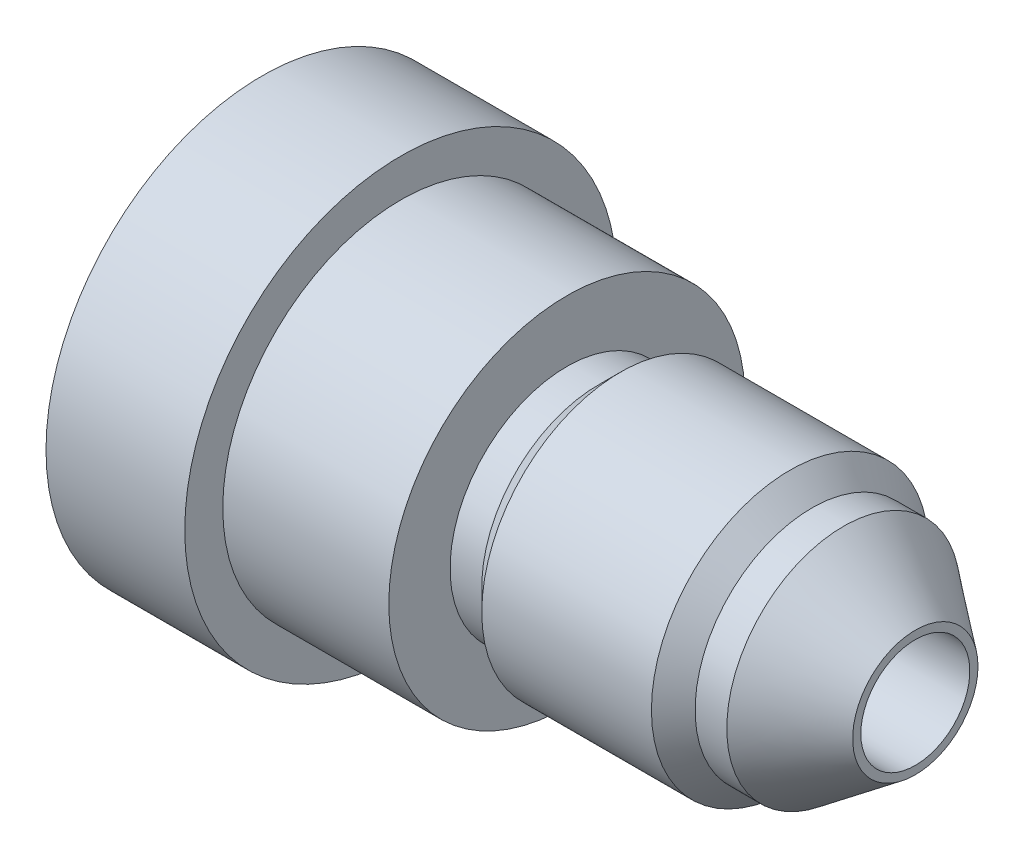
ISO-10303-21;
HEADER;
FILE_DESCRIPTION(('STEP AP214'),'2;1');
FILE_NAME('part.step','',(''),(''),'','','');
FILE_SCHEMA(('AUTOMOTIVE_DESIGN { 1 0 10303 214 1 1 1 1 }'));
ENDSEC;
DATA;
#1=APPLICATION_CONTEXT('core data for automotive mechanical design processes');
#2=APPLICATION_PROTOCOL_DEFINITION('international standard','automotive_design',2000,#1);
#3=PRODUCT_CONTEXT('',#1,'mechanical');
#4=PRODUCT('Part','Part','',(#3));
#5=PRODUCT_RELATED_PRODUCT_CATEGORY('part','',(#4));
#6=PRODUCT_DEFINITION_FORMATION('','',#4);
#7=PRODUCT_DEFINITION_CONTEXT('part definition',#1,'design');
#8=PRODUCT_DEFINITION('design','',#6,#7);
#9=PRODUCT_DEFINITION_SHAPE('','',#8);
#10=(LENGTH_UNIT() NAMED_UNIT(*) SI_UNIT(.MILLI.,.METRE.));
#11=(NAMED_UNIT(*) PLANE_ANGLE_UNIT() SI_UNIT($,.RADIAN.));
#12=(NAMED_UNIT(*) SI_UNIT($,.STERADIAN.) SOLID_ANGLE_UNIT());
#13=UNCERTAINTY_MEASURE_WITH_UNIT(LENGTH_MEASURE(1.E-05),#10,'distance_accuracy_value','');
#14=(GEOMETRIC_REPRESENTATION_CONTEXT(3) GLOBAL_UNCERTAINTY_ASSIGNED_CONTEXT((#13)) GLOBAL_UNIT_ASSIGNED_CONTEXT((#10,
#11,#12)) REPRESENTATION_CONTEXT('',''));
#15=CARTESIAN_POINT('',(0.,0.,0.));
#16=DIRECTION('',(0.,0.,1.));
#17=DIRECTION('',(1.,0.,0.));
#18=AXIS2_PLACEMENT_3D('',#15,#16,#17);
#19=CARTESIAN_POINT('',(-13.0937,0.,0.));
#20=DIRECTION('',(-1.,0.,0.));
#21=DIRECTION('',(0.,0.,1.));
#22=AXIS2_PLACEMENT_3D('',#19,#20,#21);
#23=CYLINDRICAL_SURFACE('',#22,5.55625);
#24=CARTESIAN_POINT('',(1.26938919710472,0.,0.));
#25=DIRECTION('',(1.,0.,0.));
#26=DIRECTION('',(0.,0.,-1.));
#27=AXIS2_PLACEMENT_3D('',#24,#25,#26);
#28=CIRCLE('',#27,5.55625);
#29=CARTESIAN_POINT('',(1.26938919710472,0.,-5.55625));
#30=VERTEX_POINT('',#29);
#31=EDGE_CURVE('E77',#30,#30,#28,.T.);
#32=ORIENTED_EDGE('',*,*,#31,.T.);
#33=EDGE_LOOP('',(#32));
#34=FACE_BOUND('',#33,.T.);
#35=CARTESIAN_POINT('',(8.07031304173335,0.,0.));
#36=DIRECTION('',(1.,0.,0.));
#37=DIRECTION('',(0.,0.,-1.));
#38=AXIS2_PLACEMENT_3D('',#35,#36,#37);
#39=CIRCLE('',#38,5.55625);
#40=CARTESIAN_POINT('',(8.07031304173335,0.,-5.55625));
#41=VERTEX_POINT('',#40);
#42=EDGE_CURVE('E74',#41,#41,#39,.T.);
#43=ORIENTED_EDGE('',*,*,#42,.F.);
#44=EDGE_LOOP('',(#43));
#45=FACE_BOUND('',#44,.T.);
#46=ADVANCED_FACE('F36',(#34,#45),#23,.T.);
#47=CARTESIAN_POINT('',(13.0937,2.1844,0.));
#48=DIRECTION('',(-1.,0.,0.));
#49=DIRECTION('',(0.,0.,1.));
#50=AXIS2_PLACEMENT_3D('',#47,#48,#49);
#51=PLANE('',#50);
#52=CARTESIAN_POINT('',(13.0937,0.,0.));
#53=DIRECTION('',(1.,0.,0.));
#54=DIRECTION('',(0.,0.,-1.));
#55=AXIS2_PLACEMENT_3D('',#52,#53,#54);
#56=CIRCLE('',#55,2.51206);
#57=CARTESIAN_POINT('',(13.0937,0.,-2.51206));
#58=VERTEX_POINT('',#57);
#59=EDGE_CURVE('E65',#58,#58,#56,.T.);
#60=ORIENTED_EDGE('',*,*,#59,.T.);
#61=EDGE_LOOP('',(#60));
#62=FACE_BOUND('',#61,.T.);
#63=CARTESIAN_POINT('',(13.0937,0.,0.));
#64=DIRECTION('',(-1.,0.,0.));
#65=DIRECTION('',(0.,0.,1.));
#66=AXIS2_PLACEMENT_3D('',#63,#64,#65);
#67=CIRCLE('',#66,2.1844);
#68=CARTESIAN_POINT('',(13.0937,0.,2.1844));
#69=VERTEX_POINT('',#68);
#70=EDGE_CURVE('E51',#69,#69,#67,.T.);
#71=ORIENTED_EDGE('',*,*,#70,.T.);
#72=EDGE_LOOP('',(#71));
#73=FACE_BOUND('',#72,.T.);
#74=ADVANCED_FACE('F108',(#62,#73),#51,.F.);
#75=CARTESIAN_POINT('',(-13.0937,0.,0.));
#76=DIRECTION('',(-1.,0.,0.));
#77=DIRECTION('',(0.,0.,1.));
#78=AXIS2_PLACEMENT_3D('',#75,#76,#77);
#79=CYLINDRICAL_SURFACE('',#78,8.6614);
#80=CARTESIAN_POINT('',(-13.0937,0.,0.));
#81=DIRECTION('',(-1.,0.,0.));
#82=DIRECTION('',(0.,0.,1.));
#83=AXIS2_PLACEMENT_3D('',#80,#81,#82);
#84=CIRCLE('',#83,8.6614);
#85=CARTESIAN_POINT('',(-13.0937,0.,8.6614));
#86=VERTEX_POINT('',#85);
#87=EDGE_CURVE('E62',#86,#86,#84,.T.);
#88=ORIENTED_EDGE('',*,*,#87,.F.);
#89=EDGE_LOOP('',(#88));
#90=FACE_BOUND('',#89,.T.);
#91=CARTESIAN_POINT('',(-7.5311,0.,0.));
#92=DIRECTION('',(-1.,0.,0.));
#93=DIRECTION('',(0.,0.,1.));
#94=AXIS2_PLACEMENT_3D('',#91,#92,#93);
#95=CIRCLE('',#94,8.6614);
#96=CARTESIAN_POINT('',(-7.5311,0.,8.6614));
#97=VERTEX_POINT('',#96);
#98=EDGE_CURVE('E10',#97,#97,#95,.T.);
#99=ORIENTED_EDGE('',*,*,#98,.T.);
#100=EDGE_LOOP('',(#99));
#101=FACE_BOUND('',#100,.T.);
#102=ADVANCED_FACE('F38',(#90,#101),#79,.T.);
#103=CARTESIAN_POINT('',(-7.5311,8.6614,0.));
#104=DIRECTION('',(-1.,0.,0.));
#105=DIRECTION('',(0.,0.,1.));
#106=AXIS2_PLACEMENT_3D('',#103,#104,#105);
#107=PLANE('',#106);
#108=ORIENTED_EDGE('',*,*,#98,.F.);
#109=EDGE_LOOP('',(#108));
#110=FACE_BOUND('',#109,.T.);
#111=CARTESIAN_POINT('',(-7.5311,0.,0.));
#112=DIRECTION('',(-1.,0.,0.));
#113=DIRECTION('',(0.,0.,1.));
#114=AXIS2_PLACEMENT_3D('',#111,#112,#113);
#115=CIRCLE('',#114,7.1374);
#116=CARTESIAN_POINT('',(-7.5311,0.,7.1374));
#117=VERTEX_POINT('',#116);
#118=EDGE_CURVE('E43',#117,#117,#115,.T.);
#119=ORIENTED_EDGE('',*,*,#118,.T.);
#120=EDGE_LOOP('',(#119));
#121=FACE_BOUND('',#120,.T.);
#122=ADVANCED_FACE('F102',(#110,#121),#107,.F.);
#123=CARTESIAN_POINT('',(-13.0937,0.,0.));
#124=DIRECTION('',(-1.,0.,0.));
#125=DIRECTION('',(0.,0.,1.));
#126=AXIS2_PLACEMENT_3D('',#123,#124,#125);
#127=CYLINDRICAL_SURFACE('',#126,7.1374);
#128=ORIENTED_EDGE('',*,*,#118,.F.);
#129=EDGE_LOOP('',(#128));
#130=FACE_BOUND('',#129,.T.);
#131=CARTESIAN_POINT('',(-0.876300000000002,0.,0.));
#132=DIRECTION('',(-1.,0.,0.));
#133=DIRECTION('',(0.,0.,1.));
#134=AXIS2_PLACEMENT_3D('',#131,#132,#133);
#135=CIRCLE('',#134,7.1374);
#136=CARTESIAN_POINT('',(-0.876300000000002,0.,7.1374));
#137=VERTEX_POINT('',#136);
#138=EDGE_CURVE('E47',#137,#137,#135,.T.);
#139=ORIENTED_EDGE('',*,*,#138,.T.);
#140=EDGE_LOOP('',(#139));
#141=FACE_BOUND('',#140,.T.);
#142=ADVANCED_FACE('F92',(#130,#141),#127,.T.);
#143=CARTESIAN_POINT('',(-0.876300000000002,7.1374,0.));
#144=DIRECTION('',(-1.,0.,0.));
#145=DIRECTION('',(0.,0.,1.));
#146=AXIS2_PLACEMENT_3D('',#143,#144,#145);
#147=PLANE('',#146);
#148=ORIENTED_EDGE('',*,*,#138,.F.);
#149=EDGE_LOOP('',(#148));
#150=FACE_BOUND('',#149,.T.);
#151=CARTESIAN_POINT('',(-0.876299999999969,0.,0.));
#152=DIRECTION('',(1.,0.,0.));
#153=DIRECTION('',(0.,0.,-1.));
#154=AXIS2_PLACEMENT_3D('',#151,#152,#153);
#155=CIRCLE('',#154,4.68056080289531);
#156=CARTESIAN_POINT('',(-0.876299999999969,0.,-4.68056080289531));
#157=VERTEX_POINT('',#156);
#158=EDGE_CURVE('E83',#157,#157,#155,.T.);
#159=ORIENTED_EDGE('',*,*,#158,.F.);
#160=EDGE_LOOP('',(#159));
#161=FACE_BOUND('',#160,.T.);
#162=ADVANCED_FACE('F89',(#150,#161),#147,.F.);
#163=CARTESIAN_POINT('',(-13.0937,0.,0.));
#164=DIRECTION('',(-1.,0.,0.));
#165=DIRECTION('',(0.,0.,1.));
#166=AXIS2_PLACEMENT_3D('',#163,#164,#165);
#167=CYLINDRICAL_SURFACE('',#166,2.1844);
#168=ORIENTED_EDGE('',*,*,#70,.F.);
#169=EDGE_LOOP('',(#168));
#170=FACE_BOUND('',#169,.T.);
#171=CARTESIAN_POINT('',(-6.06580332918038,0.,0.));
#172=DIRECTION('',(-1.,0.,0.));
#173=DIRECTION('',(0.,0.,1.));
#174=AXIS2_PLACEMENT_3D('',#171,#172,#173);
#175=CIRCLE('',#174,2.1844);
#176=CARTESIAN_POINT('',(-6.06580332918038,0.,2.1844));
#177=VERTEX_POINT('',#176);
#178=EDGE_CURVE('E56',#177,#177,#175,.T.);
#179=ORIENTED_EDGE('',*,*,#178,.T.);
#180=EDGE_LOOP('',(#179));
#181=FACE_BOUND('',#180,.T.);
#182=ADVANCED_FACE('F91',(#170,#181),#167,.F.);
#183=CARTESIAN_POINT('',(-13.0937,0.,0.));
#184=DIRECTION('',(-1.,0.,0.));
#185=DIRECTION('',(0.,0.,1.));
#186=AXIS2_PLACEMENT_3D('',#183,#184,#185);
#187=CONICAL_SURFACE('',#186,7.4803,0.645771823237896);
#188=CARTESIAN_POINT('',(-13.0937,0.,0.));
#189=DIRECTION('',(-1.,0.,0.));
#190=DIRECTION('',(0.,0.,1.));
#191=AXIS2_PLACEMENT_3D('',#188,#189,#190);
#192=CIRCLE('',#191,7.4803);
#193=CARTESIAN_POINT('',(-13.0937,0.,7.4803));
#194=VERTEX_POINT('',#193);
#195=EDGE_CURVE('E59',#194,#194,#192,.T.);
#196=CARTESIAN_POINT('',(-6.06580332918038,0.,2.1844));
#197=CARTESIAN_POINT('',(-6.13901058616808,0.,2.239565625));
#198=CARTESIAN_POINT('',(-6.21221784315579,0.,2.29473125));
#199=CARTESIAN_POINT('',(-6.35863235713119,0.,2.4050625));
#200=CARTESIAN_POINT('',(-6.4318396141189,0.,2.460228125));
#201=CARTESIAN_POINT('',(-6.57825412809431,0.,2.570559375));
#202=CARTESIAN_POINT('',(-6.65146138508201,0.,2.625725));
#203=CARTESIAN_POINT('',(-6.79787589905742,0.,2.73605625));
#204=CARTESIAN_POINT('',(-6.87108315604513,0.,2.791221875));
#205=CARTESIAN_POINT('',(-7.01749767002053,0.,2.901553125));
#206=CARTESIAN_POINT('',(-7.09070492700824,0.,2.95671875));
#207=CARTESIAN_POINT('',(-7.23711944098365,0.,3.06705));
#208=CARTESIAN_POINT('',(-7.31032669797135,0.,3.122215625));
#209=CARTESIAN_POINT('',(-7.45674121194676,0.,3.232546875));
#210=CARTESIAN_POINT('',(-7.52994846893446,0.,3.2877125));
#211=CARTESIAN_POINT('',(-7.67636298290987,0.,3.39804375));
#212=CARTESIAN_POINT('',(-7.74957023989758,0.,3.453209375));
#213=CARTESIAN_POINT('',(-7.89598475387299,0.,3.563540625));
#214=CARTESIAN_POINT('',(-7.96919201086069,0.,3.61870625));
#215=CARTESIAN_POINT('',(-8.1156065248361,0.,3.7290375));
#216=CARTESIAN_POINT('',(-8.1888137818238,0.,3.784203125));
#217=CARTESIAN_POINT('',(-8.33522829579921,0.,3.894534375));
#218=CARTESIAN_POINT('',(-8.40843555278692,0.,3.9497));
#219=CARTESIAN_POINT('',(-8.55485006676233,0.,4.06003125));
#220=CARTESIAN_POINT('',(-8.62805732375003,0.,4.115196875));
#221=CARTESIAN_POINT('',(-8.77447183772544,0.,4.225528125));
#222=CARTESIAN_POINT('',(-8.84767909471314,0.,4.28069375));
#223=CARTESIAN_POINT('',(-8.99409360868855,0.,4.391025));
#224=CARTESIAN_POINT('',(-9.06730086567626,0.,4.446190625));
#225=CARTESIAN_POINT('',(-9.21371537965167,0.,4.556521875));
#226=CARTESIAN_POINT('',(-9.28692263663937,0.,4.6116875));
#227=CARTESIAN_POINT('',(-9.43333715061478,0.,4.72201875));
#228=CARTESIAN_POINT('',(-9.50654440760248,0.,4.777184375));
#229=CARTESIAN_POINT('',(-9.65295892157789,0.,4.887515625));
#230=CARTESIAN_POINT('',(-9.7261661785656,0.,4.94268125));
#231=CARTESIAN_POINT('',(-9.87258069254101,0.,5.0530125));
#232=CARTESIAN_POINT('',(-9.94578794952871,0.,5.108178125));
#233=CARTESIAN_POINT('',(-10.0922024635041,0.,5.218509375));
#234=CARTESIAN_POINT('',(-10.1654097204918,0.,5.273675));
#235=CARTESIAN_POINT('',(-10.3118242344672,0.,5.38400625));
#236=CARTESIAN_POINT('',(-10.3850314914549,0.,5.439171875));
#237=CARTESIAN_POINT('',(-10.5314460054303,0.,5.549503125));
#238=CARTESIAN_POINT('',(-10.604653262418,0.,5.60466875));
#239=CARTESIAN_POINT('',(-10.7510677763935,0.,5.715));
#240=CARTESIAN_POINT('',(-10.8242750333812,0.,5.770165625));
#241=CARTESIAN_POINT('',(-10.9706895473566,0.,5.880496875));
#242=CARTESIAN_POINT('',(-11.0438968043443,0.,5.9356625));
#243=CARTESIAN_POINT('',(-11.1903113183197,0.,6.04599375));
#244=CARTESIAN_POINT('',(-11.2635185753074,0.,6.101159375));
#245=CARTESIAN_POINT('',(-11.4099330892828,0.,6.211490625));
#246=CARTESIAN_POINT('',(-11.4831403462705,0.,6.26665625));
#247=CARTESIAN_POINT('',(-11.6295548602459,0.,6.3769875));
#248=CARTESIAN_POINT('',(-11.7027621172336,0.,6.432153125));
#249=CARTESIAN_POINT('',(-11.849176631209,0.,6.542484375));
#250=CARTESIAN_POINT('',(-11.9223838881967,0.,6.59765));
#251=CARTESIAN_POINT('',(-12.0687984021721,0.,6.70798125));
#252=CARTESIAN_POINT('',(-12.1420056591598,0.,6.763146875));
#253=CARTESIAN_POINT('',(-12.2884201731352,0.,6.873478125));
#254=CARTESIAN_POINT('',(-12.361627430123,0.,6.92864375));
#255=CARTESIAN_POINT('',(-12.5080419440984,0.,7.038975));
#256=CARTESIAN_POINT('',(-12.5812492010861,0.,7.094140625));
#257=CARTESIAN_POINT('',(-12.7276637150615,0.,7.204471875));
#258=CARTESIAN_POINT('',(-12.8008709720492,0.,7.2596375));
#259=CARTESIAN_POINT('',(-12.9472854860246,0.,7.36996875));
#260=CARTESIAN_POINT('',(-13.0204927430123,0.,7.425134375));
#261=CARTESIAN_POINT('',(-13.0937,0.,7.4803));
#262=B_SPLINE_CURVE_WITH_KNOTS('',3,(#196,#197,#198,#199,#200,#201,#202,#203,#204,#205,#206,
#207,#208,#209,#210,#211,#212,#213,#214,#215,#216,#217,#218,#219,#220,#221,#222,#223,#224,#225,
#226,#227,#228,#229,#230,#231,#232,#233,#234,#235,#236,#237,#238,#239,#240,#241,#242,#243,#244,
#245,#246,#247,#248,#249,#250,#251,#252,#253,#254,#255,#256,#257,#258,#259,#260,#261),
.UNSPECIFIED.,.F.,.F.,(4,2,2,2,2,2,2,2,2,2,2,2,2,2,2,2,2,2,2,2,2,2,2,2,2,2,2,2,2,2,2,2,4),(0.,
0.274996250730332,0.549992501460664,0.824988752190996,1.09998500292133,1.37498125365166,
1.64997750438199,1.92497375511233,2.19997000584266,2.47496625657299,2.74996250730332,
3.02495875803365,3.29995500876399,3.57495125949432,3.84994751022465,4.12494376095498,
4.39994001168532,4.67493626241565,4.94993251314598,5.22492876387631,5.49992501460664,
5.77492126533698,6.04991751606731,6.32491376679764,6.59991001752797,6.87490626825831,
7.14990251898864,7.42489876971897,7.6998950204493,7.97489127117964,8.24988752190997,
8.5248837726403,8.79988002337063),.UNSPECIFIED.);
#263=EDGE_CURVE('BSEAM99',#177,#194,#262,.T.);
#264=ORIENTED_EDGE('',*,*,#178,.F.);
#265=ORIENTED_EDGE('',*,*,#195,.T.);
#266=ORIENTED_EDGE('',*,*,#263,.T.);
#267=ORIENTED_EDGE('',*,*,#263,.F.);
#268=EDGE_LOOP('',(#264,#266,#265,#267));
#269=FACE_BOUND('',#268,.T.);
#270=ADVANCED_FACE('F99',(#269),#187,.F.);
#271=CARTESIAN_POINT('',(-13.0937,8.6614,0.));
#272=DIRECTION('',(1.,0.,0.));
#273=DIRECTION('',(0.,0.,-1.));
#274=AXIS2_PLACEMENT_3D('',#271,#272,#273);
#275=PLANE('',#274);
#276=ORIENTED_EDGE('',*,*,#195,.F.);
#277=EDGE_LOOP('',(#276));
#278=FACE_BOUND('',#277,.T.);
#279=ORIENTED_EDGE('',*,*,#87,.T.);
#280=EDGE_LOOP('',(#279));
#281=FACE_BOUND('',#280,.T.);
#282=ADVANCED_FACE('F119',(#278,#281),#275,.F.);
#283=CARTESIAN_POINT('',(10.216002238838,0.,0.));
#284=DIRECTION('',(-1.,0.,0.));
#285=DIRECTION('',(0.,0.,1.));
#286=AXIS2_PLACEMENT_3D('',#283,#284,#285);
#287=CONICAL_SURFACE('',#286,4.68056080289531,0.645771823237896);
#288=ORIENTED_EDGE('',*,*,#59,.F.);
#289=EDGE_LOOP('',(#288));
#290=FACE_BOUND('',#289,.T.);
#291=CARTESIAN_POINT('',(10.216002238838,0.,0.));
#292=DIRECTION('',(1.,0.,0.));
#293=DIRECTION('',(0.,0.,-1.));
#294=AXIS2_PLACEMENT_3D('',#291,#292,#293);
#295=CIRCLE('',#294,4.68056080289531);
#296=CARTESIAN_POINT('',(10.216002238838,0.,-4.68056080289531));
#297=VERTEX_POINT('',#296);
#298=EDGE_CURVE('E68',#297,#297,#295,.T.);
#299=ORIENTED_EDGE('',*,*,#298,.T.);
#300=EDGE_LOOP('',(#299));
#301=FACE_BOUND('',#300,.T.);
#302=ADVANCED_FACE('F123',(#290,#301),#287,.T.);
#303=CARTESIAN_POINT('',(0.,0.,0.));
#304=DIRECTION('',(1.,0.,0.));
#305=DIRECTION('',(0.,0.,-1.));
#306=AXIS2_PLACEMENT_3D('',#303,#304,#305);
#307=CYLINDRICAL_SURFACE('',#306,4.68056080289531);
#308=ORIENTED_EDGE('',*,*,#298,.F.);
#309=EDGE_LOOP('',(#308));
#310=FACE_BOUND('',#309,.T.);
#311=CARTESIAN_POINT('',(8.94600223883804,0.,0.));
#312=DIRECTION('',(1.,0.,0.));
#313=DIRECTION('',(0.,0.,-1.));
#314=AXIS2_PLACEMENT_3D('',#311,#312,#313);
#315=CIRCLE('',#314,4.68056080289531);
#316=CARTESIAN_POINT('',(8.94600223883804,0.,-4.68056080289531));
#317=VERTEX_POINT('',#316);
#318=EDGE_CURVE('E71',#317,#317,#315,.T.);
#319=ORIENTED_EDGE('',*,*,#318,.T.);
#320=EDGE_LOOP('',(#319));
#321=FACE_BOUND('',#320,.T.);
#322=ADVANCED_FACE('F127',(#310,#321),#307,.T.);
#323=CARTESIAN_POINT('',(8.07031304173335,0.,0.));
#324=DIRECTION('',(-1.,0.,0.));
#325=DIRECTION('',(0.,0.,1.));
#326=AXIS2_PLACEMENT_3D('',#323,#324,#325);
#327=CONICAL_SURFACE('',#326,5.55625,0.785398163397449);
#328=ORIENTED_EDGE('',*,*,#42,.T.);
#329=EDGE_LOOP('',(#328));
#330=FACE_BOUND('',#329,.T.);
#331=ORIENTED_EDGE('',*,*,#318,.F.);
#332=EDGE_LOOP('',(#331));
#333=FACE_BOUND('',#332,.T.);
#334=ADVANCED_FACE('F131',(#330,#333),#327,.T.);
#335=CARTESIAN_POINT('',(0.393700000000032,0.,0.));
#336=DIRECTION('',(1.,0.,0.));
#337=DIRECTION('',(0.,0.,-1.));
#338=AXIS2_PLACEMENT_3D('',#335,#336,#337);
#339=CONICAL_SURFACE('',#338,4.68056080289531,0.78539816339745);
#340=ORIENTED_EDGE('',*,*,#31,.F.);
#341=EDGE_LOOP('',(#340));
#342=FACE_BOUND('',#341,.T.);
#343=CARTESIAN_POINT('',(0.393700000000032,0.,0.));
#344=DIRECTION('',(1.,0.,0.));
#345=DIRECTION('',(0.,0.,-1.));
#346=AXIS2_PLACEMENT_3D('',#343,#344,#345);
#347=CIRCLE('',#346,4.68056080289531);
#348=CARTESIAN_POINT('',(0.393700000000032,0.,-4.68056080289531));
#349=VERTEX_POINT('',#348);
#350=EDGE_CURVE('E80',#349,#349,#347,.T.);
#351=ORIENTED_EDGE('',*,*,#350,.T.);
#352=EDGE_LOOP('',(#351));
#353=FACE_BOUND('',#352,.T.);
#354=ADVANCED_FACE('F135',(#342,#353),#339,.T.);
#355=CARTESIAN_POINT('',(0.,0.,0.));
#356=DIRECTION('',(1.,0.,0.));
#357=DIRECTION('',(0.,0.,-1.));
#358=AXIS2_PLACEMENT_3D('',#355,#356,#357);
#359=CYLINDRICAL_SURFACE('',#358,4.68056080289531);
#360=ORIENTED_EDGE('',*,*,#350,.F.);
#361=EDGE_LOOP('',(#360));
#362=FACE_BOUND('',#361,.T.);
#363=ORIENTED_EDGE('',*,*,#158,.T.);
#364=EDGE_LOOP('',(#363));
#365=FACE_BOUND('',#364,.T.);
#366=ADVANCED_FACE('F87',(#362,#365),#359,.T.);
#367=CLOSED_SHELL('',(#46,#74,#102,#122,#142,#162,#182,#270,#282,#302,#322,#334,#354,#366));
#368=MANIFOLD_SOLID_BREP('B2',#367);
#369=ADVANCED_BREP_SHAPE_REPRESENTATION('',(#18,#368),#14);
#370=SHAPE_DEFINITION_REPRESENTATION(#9,#369);
ENDSEC;
END-ISO-10303-21;
